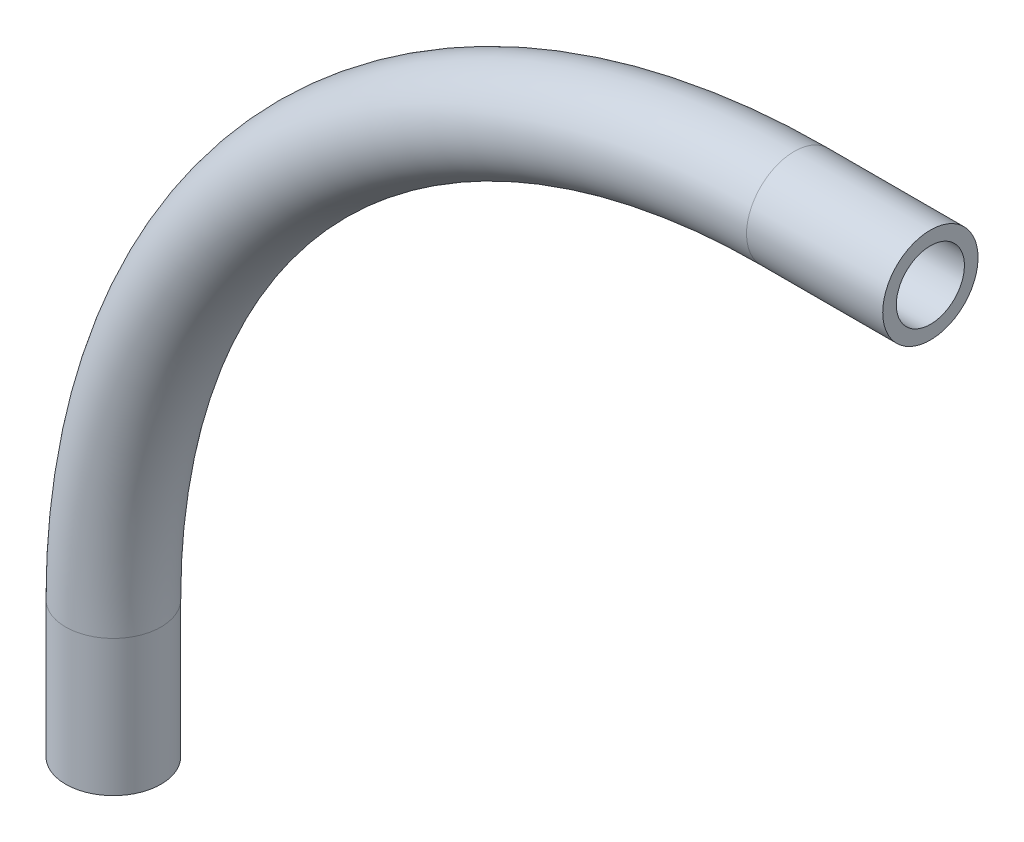
ISO-10303-21;
HEADER;
FILE_DESCRIPTION(('STEP AP214'),'2;1');
FILE_NAME('part.step','',(''),(''),'','','');
FILE_SCHEMA(('AUTOMOTIVE_DESIGN { 1 0 10303 214 1 1 1 1 }'));
ENDSEC;
DATA;
#1=APPLICATION_CONTEXT('core data for automotive mechanical design processes');
#2=APPLICATION_PROTOCOL_DEFINITION('international standard','automotive_design',2000,#1);
#3=PRODUCT_CONTEXT('',#1,'mechanical');
#4=PRODUCT('Part','Part','',(#3));
#5=PRODUCT_RELATED_PRODUCT_CATEGORY('part','',(#4));
#6=PRODUCT_DEFINITION_FORMATION('','',#4);
#7=PRODUCT_DEFINITION_CONTEXT('part definition',#1,'design');
#8=PRODUCT_DEFINITION('design','',#6,#7);
#9=PRODUCT_DEFINITION_SHAPE('','',#8);
#10=(LENGTH_UNIT() NAMED_UNIT(*) SI_UNIT(.MILLI.,.METRE.));
#11=(NAMED_UNIT(*) PLANE_ANGLE_UNIT() SI_UNIT($,.RADIAN.));
#12=(NAMED_UNIT(*) SI_UNIT($,.STERADIAN.) SOLID_ANGLE_UNIT());
#13=UNCERTAINTY_MEASURE_WITH_UNIT(LENGTH_MEASURE(1.E-05),#10,'distance_accuracy_value','');
#14=(GEOMETRIC_REPRESENTATION_CONTEXT(3) GLOBAL_UNCERTAINTY_ASSIGNED_CONTEXT((#13)) GLOBAL_UNIT_ASSIGNED_CONTEXT((#10,
#11,#12)) REPRESENTATION_CONTEXT('',''));
#15=CARTESIAN_POINT('',(0.,0.,0.));
#16=DIRECTION('',(0.,0.,1.));
#17=DIRECTION('',(1.,0.,0.));
#18=AXIS2_PLACEMENT_3D('',#15,#16,#17);
#19=CARTESIAN_POINT('',(-50.,-10.,0.));
#20=DIRECTION('',(0.,-1.,0.));
#21=DIRECTION('',(0.,0.,1.));
#22=AXIS2_PLACEMENT_3D('',#19,#20,#21);
#23=PLANE('',#22);
#24=CARTESIAN_POINT('',(-50.,-10.,0.));
#25=DIRECTION('',(0.,-1.,0.));
#26=DIRECTION('',(0.,0.,-1.));
#27=AXIS2_PLACEMENT_3D('',#24,#25,#26);
#28=CIRCLE('',#27,2.5);
#29=CARTESIAN_POINT('',(-50.,-10.,-2.5));
#30=VERTEX_POINT('',#29);
#31=EDGE_CURVE('E87',#30,#30,#28,.F.);
#32=ORIENTED_EDGE('',*,*,#31,.T.);
#33=EDGE_LOOP('',(#32));
#34=FACE_BOUND('',#33,.T.);
#35=CARTESIAN_POINT('',(-50.,-10.,0.));
#36=DIRECTION('',(0.,-1.,0.));
#37=DIRECTION('',(0.,0.,1.));
#38=AXIS2_PLACEMENT_3D('',#35,#36,#37);
#39=CIRCLE('',#38,3.5);
#40=CARTESIAN_POINT('',(-50.,-10.,3.5));
#41=VERTEX_POINT('',#40);
#42=EDGE_CURVE('E76',#41,#41,#39,.T.);
#43=ORIENTED_EDGE('',*,*,#42,.T.);
#44=EDGE_LOOP('',(#43));
#45=FACE_BOUND('',#44,.T.);
#46=ADVANCED_FACE('F59',(#34,#45),#23,.T.);
#47=CARTESIAN_POINT('',(10.,50.,0.));
#48=DIRECTION('',(-1.,0.,0.));
#49=DIRECTION('',(0.,0.,1.));
#50=AXIS2_PLACEMENT_3D('',#47,#48,#49);
#51=PLANE('',#50);
#52=CARTESIAN_POINT('',(10.,50.,0.));
#53=DIRECTION('',(-1.,0.,0.));
#54=DIRECTION('',(0.,0.,1.));
#55=AXIS2_PLACEMENT_3D('',#52,#53,#54);
#56=CIRCLE('',#55,2.5);
#57=CARTESIAN_POINT('',(10.,50.,2.5));
#58=VERTEX_POINT('',#57);
#59=EDGE_CURVE('E82',#58,#58,#56,.F.);
#60=ORIENTED_EDGE('',*,*,#59,.F.);
#61=EDGE_LOOP('',(#60));
#62=FACE_BOUND('',#61,.T.);
#63=CARTESIAN_POINT('',(10.,50.,0.));
#64=DIRECTION('',(-1.,0.,0.));
#65=DIRECTION('',(0.,0.,1.));
#66=AXIS2_PLACEMENT_3D('',#63,#64,#65);
#67=CIRCLE('',#66,3.5);
#68=CARTESIAN_POINT('',(10.,50.,3.5));
#69=VERTEX_POINT('',#68);
#70=EDGE_CURVE('E11',#69,#69,#67,.T.);
#71=ORIENTED_EDGE('',*,*,#70,.F.);
#72=EDGE_LOOP('',(#71));
#73=FACE_BOUND('',#72,.T.);
#74=ADVANCED_FACE('F125',(#62,#73),#51,.F.);
#75=CARTESIAN_POINT('',(-50.,-10.,0.));
#76=DIRECTION('',(0.,1.,0.));
#77=DIRECTION('',(0.,0.,1.));
#78=AXIS2_PLACEMENT_3D('',#75,#76,#77);
#79=CYLINDRICAL_SURFACE('',#78,3.5);
#80=CARTESIAN_POINT('',(-50.,0.,0.));
#81=DIRECTION('',(0.,-1.,0.));
#82=DIRECTION('',(0.,0.,1.));
#83=AXIS2_PLACEMENT_3D('',#80,#81,#82);
#84=CIRCLE('',#83,3.5);
#85=CARTESIAN_POINT('',(-53.5,0.,0.));
#86=VERTEX_POINT('',#85);
#87=EDGE_CURVE('E71',#86,#86,#84,.T.);
#88=ORIENTED_EDGE('',*,*,#87,.T.);
#89=EDGE_LOOP('',(#88));
#90=FACE_BOUND('',#89,.T.);
#91=ORIENTED_EDGE('',*,*,#42,.F.);
#92=EDGE_LOOP('',(#91));
#93=FACE_BOUND('',#92,.T.);
#94=ADVANCED_FACE('F121',(#90,#93),#79,.T.);
#95=CARTESIAN_POINT('',(0.,0.,0.));
#96=DIRECTION('',(0.,0.,-1.));
#97=DIRECTION('',(-1.,0.,0.));
#98=AXIS2_PLACEMENT_3D('',#95,#96,#97);
#99=TOROIDAL_SURFACE('',#98,50.,3.5);
#100=CARTESIAN_POINT('',(0.,50.,0.));
#101=DIRECTION('',(-1.,0.,0.));
#102=DIRECTION('',(0.,0.,1.));
#103=AXIS2_PLACEMENT_3D('',#100,#101,#102);
#104=CIRCLE('',#103,3.5);
#105=CARTESIAN_POINT('',(0.,53.5,0.));
#106=VERTEX_POINT('',#105);
#107=EDGE_CURVE('E66',#106,#106,#104,.T.);
#108=CARTESIAN_POINT('',(0.,0.,0.));
#109=DIRECTION('',(0.,0.,-1.));
#110=DIRECTION('',(-1.,0.,0.));
#111=AXIS2_PLACEMENT_3D('',#108,#109,#110);
#112=CIRCLE('',#111,53.5);
#113=EDGE_CURVE('',#86,#106,#112,.T.);
#114=ORIENTED_EDGE('',*,*,#87,.F.);
#115=ORIENTED_EDGE('',*,*,#107,.T.);
#116=ORIENTED_EDGE('',*,*,#113,.T.);
#117=ORIENTED_EDGE('',*,*,#113,.F.);
#118=EDGE_LOOP('',(#114,#116,#115,#117));
#119=FACE_BOUND('',#118,.T.);
#120=ADVANCED_FACE('F116',(#119),#99,.T.);
#121=CARTESIAN_POINT('',(0.,50.,0.));
#122=DIRECTION('',(1.,0.,0.));
#123=DIRECTION('',(0.,0.,-1.));
#124=AXIS2_PLACEMENT_3D('',#121,#122,#123);
#125=CYLINDRICAL_SURFACE('',#124,3.5);
#126=ORIENTED_EDGE('',*,*,#70,.T.);
#127=EDGE_LOOP('',(#126));
#128=FACE_BOUND('',#127,.T.);
#129=ORIENTED_EDGE('',*,*,#107,.F.);
#130=EDGE_LOOP('',(#129));
#131=FACE_BOUND('',#130,.T.);
#132=ADVANCED_FACE('F112',(#128,#131),#125,.T.);
#133=CARTESIAN_POINT('',(-50.,-11.,0.));
#134=DIRECTION('',(0.,1.,0.));
#135=DIRECTION('',(0.,0.,1.));
#136=AXIS2_PLACEMENT_3D('',#133,#134,#135);
#137=CYLINDRICAL_SURFACE('',#136,2.5);
#138=CARTESIAN_POINT('',(-50.,0.,0.));
#139=DIRECTION('',(0.,1.,0.));
#140=DIRECTION('',(0.,0.,1.));
#141=AXIS2_PLACEMENT_3D('',#138,#139,#140);
#142=CIRCLE('',#141,2.5);
#143=CARTESIAN_POINT('',(-52.5,0.,0.));
#144=VERTEX_POINT('',#143);
#145=EDGE_CURVE('E91',#144,#144,#142,.T.);
#146=ORIENTED_EDGE('',*,*,#145,.T.);
#147=EDGE_LOOP('',(#146));
#148=FACE_BOUND('',#147,.T.);
#149=ORIENTED_EDGE('',*,*,#31,.F.);
#150=EDGE_LOOP('',(#149));
#151=FACE_BOUND('',#150,.T.);
#152=ADVANCED_FACE('F106',(#148,#151),#137,.F.);
#153=CARTESIAN_POINT('',(0.,0.,0.));
#154=DIRECTION('',(0.,0.,-1.));
#155=DIRECTION('',(-1.,0.,0.));
#156=AXIS2_PLACEMENT_3D('',#153,#154,#155);
#157=TOROIDAL_SURFACE('',#156,50.,2.5);
#158=CARTESIAN_POINT('',(0.,50.,0.));
#159=DIRECTION('',(1.,0.,0.));
#160=DIRECTION('',(0.,0.,1.));
#161=AXIS2_PLACEMENT_3D('',#158,#159,#160);
#162=CIRCLE('',#161,2.5);
#163=CARTESIAN_POINT('',(0.,52.5,0.));
#164=VERTEX_POINT('',#163);
#165=EDGE_CURVE('E86',#164,#164,#162,.T.);
#166=CARTESIAN_POINT('',(0.,0.,0.));
#167=DIRECTION('',(0.,0.,-1.));
#168=DIRECTION('',(-1.,0.,0.));
#169=AXIS2_PLACEMENT_3D('',#166,#167,#168);
#170=CIRCLE('',#169,52.5);
#171=EDGE_CURVE('',#144,#164,#170,.T.);
#172=ORIENTED_EDGE('',*,*,#145,.F.);
#173=ORIENTED_EDGE('',*,*,#165,.T.);
#174=ORIENTED_EDGE('',*,*,#171,.T.);
#175=ORIENTED_EDGE('',*,*,#171,.F.);
#176=EDGE_LOOP('',(#172,#174,#173,#175));
#177=FACE_BOUND('',#176,.T.);
#178=ADVANCED_FACE('F99',(#177),#157,.F.);
#179=CARTESIAN_POINT('',(0.,50.,0.));
#180=DIRECTION('',(1.,0.,0.));
#181=DIRECTION('',(0.,0.,-1.));
#182=AXIS2_PLACEMENT_3D('',#179,#180,#181);
#183=CYLINDRICAL_SURFACE('',#182,2.5);
#184=ORIENTED_EDGE('',*,*,#59,.T.);
#185=EDGE_LOOP('',(#184));
#186=FACE_BOUND('',#185,.T.);
#187=ORIENTED_EDGE('',*,*,#165,.F.);
#188=EDGE_LOOP('',(#187));
#189=FACE_BOUND('',#188,.T.);
#190=ADVANCED_FACE('F102',(#186,#189),#183,.F.);
#191=CLOSED_SHELL('',(#46,#74,#94,#120,#132,#152,#178,#190));
#192=MANIFOLD_SOLID_BREP('B2',#191);
#193=ADVANCED_BREP_SHAPE_REPRESENTATION('',(#18,#192),#14);
#194=SHAPE_DEFINITION_REPRESENTATION(#9,#193);
ENDSEC;
END-ISO-10303-21;
